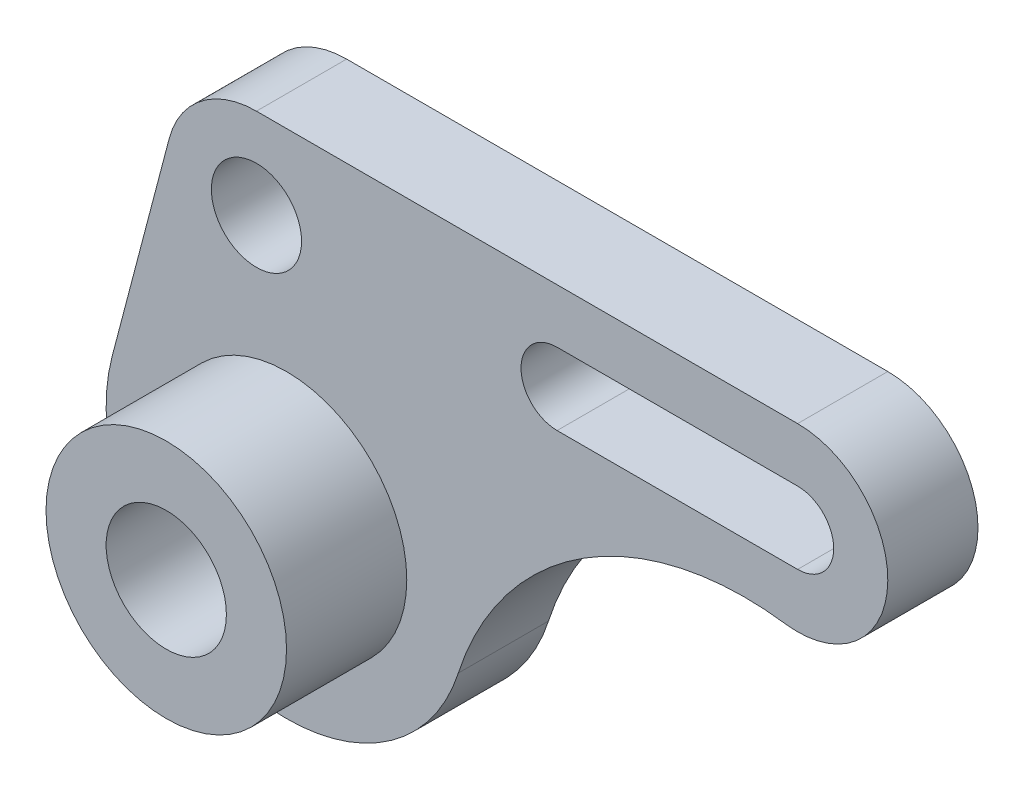
ISO-10303-21;
HEADER;
FILE_DESCRIPTION(('STEP AP214'),'2;1');
FILE_NAME('part.step','',(''),(''),'','','');
FILE_SCHEMA(('AUTOMOTIVE_DESIGN { 1 0 10303 214 1 1 1 1 }'));
ENDSEC;
DATA;
#1=APPLICATION_CONTEXT('core data for automotive mechanical design processes');
#2=APPLICATION_PROTOCOL_DEFINITION('international standard','automotive_design',2000,#1);
#3=PRODUCT_CONTEXT('',#1,'mechanical');
#4=PRODUCT('Part','Part','',(#3));
#5=PRODUCT_RELATED_PRODUCT_CATEGORY('part','',(#4));
#6=PRODUCT_DEFINITION_FORMATION('','',#4);
#7=PRODUCT_DEFINITION_CONTEXT('part definition',#1,'design');
#8=PRODUCT_DEFINITION('design','',#6,#7);
#9=PRODUCT_DEFINITION_SHAPE('','',#8);
#10=(LENGTH_UNIT() NAMED_UNIT(*) SI_UNIT(.MILLI.,.METRE.));
#11=(NAMED_UNIT(*) PLANE_ANGLE_UNIT() SI_UNIT($,.RADIAN.));
#12=(NAMED_UNIT(*) SI_UNIT($,.STERADIAN.) SOLID_ANGLE_UNIT());
#13=UNCERTAINTY_MEASURE_WITH_UNIT(LENGTH_MEASURE(1.E-05),#10,'distance_accuracy_value','');
#14=(GEOMETRIC_REPRESENTATION_CONTEXT(3) GLOBAL_UNCERTAINTY_ASSIGNED_CONTEXT((#13)) GLOBAL_UNIT_ASSIGNED_CONTEXT((#10,
#11,#12)) REPRESENTATION_CONTEXT('',''));
#15=CARTESIAN_POINT('',(0.,0.,0.));
#16=DIRECTION('',(0.,0.,1.));
#17=DIRECTION('',(1.,0.,0.));
#18=AXIS2_PLACEMENT_3D('',#15,#16,#17);
#19=CARTESIAN_POINT('',(0.,0.,7.5));
#20=DIRECTION('',(0.,0.,1.));
#21=DIRECTION('',(1.,0.,0.));
#22=AXIS2_PLACEMENT_3D('',#19,#20,#21);
#23=PLANE('',#22);
#24=DIRECTION('',(1.,0.,0.));
#25=VECTOR('',#24,1.);
#26=CARTESIAN_POINT('',(0.,55.,7.5));
#27=LINE('',#26,#25);
#28=CARTESIAN_POINT('',(-5.00000000000001,55.,7.5));
#29=VERTEX_POINT('',#28);
#30=CARTESIAN_POINT('',(85.,55.,7.5));
#31=VERTEX_POINT('',#30);
#32=EDGE_CURVE('E214',#29,#31,#27,.T.);
#33=ORIENTED_EDGE('',*,*,#32,.F.);
#34=CARTESIAN_POINT('',(-5.00000000000001,40.,7.5));
#35=DIRECTION('',(0.,0.,1.));
#36=DIRECTION('',(1.,0.,0.));
#37=AXIS2_PLACEMENT_3D('',#34,#35,#36);
#38=CIRCLE('',#37,15.);
#39=CARTESIAN_POINT('',(-19.507658043473,43.8115427445659,7.5));
#40=VERTEX_POINT('',#39);
#41=EDGE_CURVE('E223',#29,#40,#38,.T.);
#42=ORIENTED_EDGE('',*,*,#41,.T.);
#43=DIRECTION('',(0.254102849637725,0.967177202898201,0.));
#44=VECTOR('',#43,1.);
#45=CARTESIAN_POINT('',(-29.015316086946,7.62308548913174,7.5));
#46=LINE('',#45,#44);
#47=CARTESIAN_POINT('',(-29.015316086946,7.62308548913174,7.5));
#48=VERTEX_POINT('',#47);
#49=EDGE_CURVE('E132',#48,#40,#46,.T.);
#50=ORIENTED_EDGE('',*,*,#49,.F.);
#51=CARTESIAN_POINT('',(0.,0.,7.5));
#52=DIRECTION('',(0.,0.,1.));
#53=DIRECTION('',(1.,0.,0.));
#54=AXIS2_PLACEMENT_3D('',#51,#52,#53);
#55=CIRCLE('',#54,30.);
#56=CARTESIAN_POINT('',(28.570577695616,-9.14997760318401,7.5));
#57=VERTEX_POINT('',#56);
#58=EDGE_CURVE('E126',#48,#57,#55,.T.);
#59=ORIENTED_EDGE('',*,*,#58,.T.);
#60=CARTESIAN_POINT('',(76.1882071883094,-24.3999402751574,7.5));
#61=DIRECTION('',(0.,0.,1.));
#62=DIRECTION('',(1.,0.,0.));
#63=AXIS2_PLACEMENT_3D('',#60,#61,#62);
#64=CIRCLE('',#63,50.);
#65=CARTESIAN_POINT('',(82.9665093511483,25.1384753211175,7.5));
#66=VERTEX_POINT('',#65);
#67=EDGE_CURVE('E130',#66,#57,#64,.T.);
#68=ORIENTED_EDGE('',*,*,#67,.F.);
#69=CARTESIAN_POINT('',(85.,40.,7.5));
#70=DIRECTION('',(0.,0.,1.));
#71=DIRECTION('',(1.,0.,0.));
#72=AXIS2_PLACEMENT_3D('',#69,#70,#71);
#73=CIRCLE('',#72,15.);
#74=EDGE_CURVE('E58',#66,#31,#73,.T.);
#75=ORIENTED_EDGE('',*,*,#74,.T.);
#76=EDGE_LOOP('',(#33,#42,#50,#59,#68,#75));
#77=FACE_BOUND('',#76,.T.);
#78=CARTESIAN_POINT('',(45.,40.,7.5));
#79=DIRECTION('',(0.,0.,1.));
#80=DIRECTION('',(1.,0.,0.));
#81=AXIS2_PLACEMENT_3D('',#78,#79,#80);
#82=CIRCLE('',#81,5.99999999999999);
#83=CARTESIAN_POINT('',(45.,46.,7.5));
#84=VERTEX_POINT('',#83);
#85=CARTESIAN_POINT('',(45.,34.,7.5));
#86=VERTEX_POINT('',#85);
#87=EDGE_CURVE('E218',#84,#86,#82,.T.);
#88=ORIENTED_EDGE('',*,*,#87,.F.);
#89=DIRECTION('',(-1.,0.,0.));
#90=VECTOR('',#89,1.);
#91=CARTESIAN_POINT('',(0.,46.,7.5));
#92=LINE('',#91,#90);
#93=CARTESIAN_POINT('',(85.,46.,7.5));
#94=VERTEX_POINT('',#93);
#95=EDGE_CURVE('E200',#94,#84,#92,.T.);
#96=ORIENTED_EDGE('',*,*,#95,.F.);
#97=CARTESIAN_POINT('',(85.,40.,7.5));
#98=DIRECTION('',(0.,0.,1.));
#99=DIRECTION('',(1.,0.,0.));
#100=AXIS2_PLACEMENT_3D('',#97,#98,#99);
#101=CIRCLE('',#100,6.);
#102=CARTESIAN_POINT('',(85.,34.,7.5));
#103=VERTEX_POINT('',#102);
#104=EDGE_CURVE('E210',#103,#94,#101,.T.);
#105=ORIENTED_EDGE('',*,*,#104,.F.);
#106=DIRECTION('',(-1.,0.,0.));
#107=VECTOR('',#106,1.);
#108=CARTESIAN_POINT('',(0.,34.,7.5));
#109=LINE('',#108,#107);
#110=EDGE_CURVE('E212',#103,#86,#109,.T.);
#111=ORIENTED_EDGE('',*,*,#110,.T.);
#112=EDGE_LOOP('',(#88,#96,#105,#111));
#113=FACE_BOUND('',#112,.T.);
#114=CARTESIAN_POINT('',(-5.00000000000001,40.,7.5));
#115=DIRECTION('',(0.,0.,1.));
#116=DIRECTION('',(1.,0.,0.));
#117=AXIS2_PLACEMENT_3D('',#114,#115,#116);
#118=CIRCLE('',#117,7.5);
#119=CARTESIAN_POINT('',(2.49999999999999,40.,7.5));
#120=VERTEX_POINT('',#119);
#121=EDGE_CURVE('E184',#120,#120,#118,.T.);
#122=ORIENTED_EDGE('',*,*,#121,.F.);
#123=EDGE_LOOP('',(#122));
#124=FACE_BOUND('',#123,.T.);
#125=CARTESIAN_POINT('',(0.,0.,7.5));
#126=DIRECTION('',(0.,0.,1.));
#127=DIRECTION('',(1.,0.,0.));
#128=AXIS2_PLACEMENT_3D('',#125,#126,#127);
#129=CIRCLE('',#128,20.);
#130=CARTESIAN_POINT('',(20.,0.,7.5));
#131=VERTEX_POINT('',#130);
#132=EDGE_CURVE('E411',#131,#131,#129,.T.);
#133=ORIENTED_EDGE('',*,*,#132,.F.);
#134=EDGE_LOOP('',(#133));
#135=FACE_BOUND('',#134,.T.);
#136=ADVANCED_FACE('F39',(#77,#113,#124,#135),#23,.T.);
#137=CARTESIAN_POINT('',(0.,55.,7.5));
#138=DIRECTION('',(0.,1.,0.));
#139=DIRECTION('',(0.,0.,1.));
#140=AXIS2_PLACEMENT_3D('',#137,#138,#139);
#141=PLANE('',#140);
#142=DIRECTION('',(1.,0.,0.));
#143=VECTOR('',#142,1.);
#144=CARTESIAN_POINT('',(0.,55.,-7.5));
#145=LINE('',#144,#143);
#146=CARTESIAN_POINT('',(-5.00000000000001,55.,-7.5));
#147=VERTEX_POINT('',#146);
#148=CARTESIAN_POINT('',(85.,55.,-7.5));
#149=VERTEX_POINT('',#148);
#150=EDGE_CURVE('E170',#147,#149,#145,.T.);
#151=ORIENTED_EDGE('',*,*,#150,.F.);
#152=DIRECTION('',(0.,0.,-1.));
#153=VECTOR('',#152,1.);
#154=CARTESIAN_POINT('',(-5.00000000000001,55.,7.5));
#155=LINE('',#154,#153);
#156=EDGE_CURVE('E11',#29,#147,#155,.T.);
#157=ORIENTED_EDGE('',*,*,#156,.F.);
#158=ORIENTED_EDGE('',*,*,#32,.T.);
#159=DIRECTION('',(0.,0.,-1.));
#160=VECTOR('',#159,1.);
#161=CARTESIAN_POINT('',(85.,55.,7.5));
#162=LINE('',#161,#160);
#163=EDGE_CURVE('E98',#31,#149,#162,.T.);
#164=ORIENTED_EDGE('',*,*,#163,.T.);
#165=EDGE_LOOP('',(#151,#157,#158,#164));
#166=FACE_BOUND('',#165,.T.);
#167=ADVANCED_FACE('F230',(#166),#141,.T.);
#168=CARTESIAN_POINT('',(-5.00000000000001,40.,7.5));
#169=DIRECTION('',(0.,0.,-1.));
#170=DIRECTION('',(-1.,0.,0.));
#171=AXIS2_PLACEMENT_3D('',#168,#169,#170);
#172=CYLINDRICAL_SURFACE('',#171,15.);
#173=CARTESIAN_POINT('',(-5.00000000000001,40.,-7.5));
#174=DIRECTION('',(0.,0.,1.));
#175=DIRECTION('',(1.,0.,0.));
#176=AXIS2_PLACEMENT_3D('',#173,#174,#175);
#177=CIRCLE('',#176,15.);
#178=CARTESIAN_POINT('',(-19.507658043473,43.8115427445659,-7.5));
#179=VERTEX_POINT('',#178);
#180=EDGE_CURVE('E173',#147,#179,#177,.T.);
#181=ORIENTED_EDGE('',*,*,#180,.T.);
#182=DIRECTION('',(0.,0.,-1.));
#183=VECTOR('',#182,1.);
#184=CARTESIAN_POINT('',(-19.507658043473,43.8115427445659,7.5));
#185=LINE('',#184,#183);
#186=EDGE_CURVE('E49',#40,#179,#185,.T.);
#187=ORIENTED_EDGE('',*,*,#186,.F.);
#188=ORIENTED_EDGE('',*,*,#41,.F.);
#189=ORIENTED_EDGE('',*,*,#156,.T.);
#190=EDGE_LOOP('',(#181,#187,#188,#189));
#191=FACE_BOUND('',#190,.T.);
#192=ADVANCED_FACE('F233',(#191),#172,.T.);
#193=CARTESIAN_POINT('',(-29.015316086946,7.62308548913174,7.5));
#194=DIRECTION('',(-0.967177202898201,0.254102849637725,0.));
#195=DIRECTION('',(-0.254102849637725,-0.967177202898201,0.));
#196=AXIS2_PLACEMENT_3D('',#193,#194,#195);
#197=PLANE('',#196);
#198=DIRECTION('',(0.254102849637725,0.967177202898201,0.));
#199=VECTOR('',#198,1.);
#200=CARTESIAN_POINT('',(-29.015316086946,7.62308548913174,-7.5));
#201=LINE('',#200,#199);
#202=CARTESIAN_POINT('',(-29.015316086946,7.62308548913174,-7.5));
#203=VERTEX_POINT('',#202);
#204=EDGE_CURVE('E176',#203,#179,#201,.T.);
#205=ORIENTED_EDGE('',*,*,#204,.F.);
#206=DIRECTION('',(0.,0.,-1.));
#207=VECTOR('',#206,1.);
#208=CARTESIAN_POINT('',(-29.015316086946,7.62308548913174,7.5));
#209=LINE('',#208,#207);
#210=EDGE_CURVE('E143',#48,#203,#209,.T.);
#211=ORIENTED_EDGE('',*,*,#210,.F.);
#212=ORIENTED_EDGE('',*,*,#49,.T.);
#213=ORIENTED_EDGE('',*,*,#186,.T.);
#214=EDGE_LOOP('',(#205,#211,#212,#213));
#215=FACE_BOUND('',#214,.T.);
#216=ADVANCED_FACE('F226',(#215),#197,.T.);
#217=CARTESIAN_POINT('',(0.,0.,7.5));
#218=DIRECTION('',(0.,0.,-1.));
#219=DIRECTION('',(-1.,0.,0.));
#220=AXIS2_PLACEMENT_3D('',#217,#218,#219);
#221=CYLINDRICAL_SURFACE('',#220,30.);
#222=CARTESIAN_POINT('',(0.,0.,-7.5));
#223=DIRECTION('',(0.,0.,1.));
#224=DIRECTION('',(1.,0.,0.));
#225=AXIS2_PLACEMENT_3D('',#222,#223,#224);
#226=CIRCLE('',#225,30.);
#227=CARTESIAN_POINT('',(28.570577695616,-9.14997760318401,-7.5));
#228=VERTEX_POINT('',#227);
#229=EDGE_CURVE('E139',#203,#228,#226,.T.);
#230=ORIENTED_EDGE('',*,*,#229,.T.);
#231=DIRECTION('',(0.,0.,-1.));
#232=VECTOR('',#231,1.);
#233=CARTESIAN_POINT('',(28.570577695616,-9.14997760318401,7.5));
#234=LINE('',#233,#232);
#235=EDGE_CURVE('E136',#57,#228,#234,.T.);
#236=ORIENTED_EDGE('',*,*,#235,.F.);
#237=ORIENTED_EDGE('',*,*,#58,.F.);
#238=ORIENTED_EDGE('',*,*,#210,.T.);
#239=EDGE_LOOP('',(#230,#236,#237,#238));
#240=FACE_BOUND('',#239,.T.);
#241=ADVANCED_FACE('F137',(#240),#221,.T.);
#242=CARTESIAN_POINT('',(76.1882071883094,-24.3999402751574,7.5));
#243=DIRECTION('',(0.,0.,-1.));
#244=DIRECTION('',(-1.,0.,0.));
#245=AXIS2_PLACEMENT_3D('',#242,#243,#244);
#246=CYLINDRICAL_SURFACE('',#245,50.);
#247=CARTESIAN_POINT('',(76.1882071883094,-24.3999402751574,-7.5));
#248=DIRECTION('',(0.,0.,1.));
#249=DIRECTION('',(1.,0.,0.));
#250=AXIS2_PLACEMENT_3D('',#247,#248,#249);
#251=CIRCLE('',#250,50.);
#252=CARTESIAN_POINT('',(82.9665093511483,25.1384753211175,-7.5));
#253=VERTEX_POINT('',#252);
#254=EDGE_CURVE('E180',#253,#228,#251,.T.);
#255=ORIENTED_EDGE('',*,*,#254,.F.);
#256=DIRECTION('',(0.,0.,-1.));
#257=VECTOR('',#256,1.);
#258=CARTESIAN_POINT('',(82.9665093511483,25.1384753211175,7.5));
#259=LINE('',#258,#257);
#260=EDGE_CURVE('E91',#66,#253,#259,.T.);
#261=ORIENTED_EDGE('',*,*,#260,.F.);
#262=ORIENTED_EDGE('',*,*,#67,.T.);
#263=ORIENTED_EDGE('',*,*,#235,.T.);
#264=EDGE_LOOP('',(#255,#261,#262,#263));
#265=FACE_BOUND('',#264,.T.);
#266=ADVANCED_FACE('F145',(#265),#246,.F.);
#267=CARTESIAN_POINT('',(45.,40.,7.5));
#268=DIRECTION('',(0.,0.,-1.));
#269=DIRECTION('',(-1.,0.,0.));
#270=AXIS2_PLACEMENT_3D('',#267,#268,#269);
#271=CYLINDRICAL_SURFACE('',#270,5.99999999999999);
#272=CARTESIAN_POINT('',(45.,40.,-7.5));
#273=DIRECTION('',(0.,0.,1.));
#274=DIRECTION('',(1.,0.,0.));
#275=AXIS2_PLACEMENT_3D('',#272,#273,#274);
#276=CIRCLE('',#275,5.99999999999999);
#277=CARTESIAN_POINT('',(45.,46.,-7.5));
#278=VERTEX_POINT('',#277);
#279=CARTESIAN_POINT('',(45.,34.,-7.5));
#280=VERTEX_POINT('',#279);
#281=EDGE_CURVE('E158',#278,#280,#276,.T.);
#282=ORIENTED_EDGE('',*,*,#281,.F.);
#283=DIRECTION('',(0.,0.,-1.));
#284=VECTOR('',#283,1.);
#285=CARTESIAN_POINT('',(45.,46.,7.5));
#286=LINE('',#285,#284);
#287=EDGE_CURVE('E43',#84,#278,#286,.T.);
#288=ORIENTED_EDGE('',*,*,#287,.F.);
#289=ORIENTED_EDGE('',*,*,#87,.T.);
#290=DIRECTION('',(0.,0.,-1.));
#291=VECTOR('',#290,1.);
#292=CARTESIAN_POINT('',(45.,34.,7.5));
#293=LINE('',#292,#291);
#294=EDGE_CURVE('E147',#86,#280,#293,.T.);
#295=ORIENTED_EDGE('',*,*,#294,.T.);
#296=EDGE_LOOP('',(#282,#288,#289,#295));
#297=FACE_BOUND('',#296,.T.);
#298=ADVANCED_FACE('F201',(#297),#271,.F.);
#299=CARTESIAN_POINT('',(0.,46.,7.5));
#300=DIRECTION('',(0.,-1.,0.));
#301=DIRECTION('',(1.,0.,0.));
#302=AXIS2_PLACEMENT_3D('',#299,#300,#301);
#303=PLANE('',#302);
#304=DIRECTION('',(-1.,0.,0.));
#305=VECTOR('',#304,1.);
#306=CARTESIAN_POINT('',(0.,46.,-7.5));
#307=LINE('',#306,#305);
#308=CARTESIAN_POINT('',(85.,46.,-7.5));
#309=VERTEX_POINT('',#308);
#310=EDGE_CURVE('E161',#309,#278,#307,.T.);
#311=ORIENTED_EDGE('',*,*,#310,.F.);
#312=DIRECTION('',(0.,0.,-1.));
#313=VECTOR('',#312,1.);
#314=CARTESIAN_POINT('',(85.,46.,7.5));
#315=LINE('',#314,#313);
#316=EDGE_CURVE('E191',#94,#309,#315,.T.);
#317=ORIENTED_EDGE('',*,*,#316,.F.);
#318=ORIENTED_EDGE('',*,*,#95,.T.);
#319=ORIENTED_EDGE('',*,*,#287,.T.);
#320=EDGE_LOOP('',(#311,#317,#318,#319));
#321=FACE_BOUND('',#320,.T.);
#322=ADVANCED_FACE('F198',(#321),#303,.T.);
#323=CARTESIAN_POINT('',(85.,40.,7.5));
#324=DIRECTION('',(0.,0.,-1.));
#325=DIRECTION('',(-1.,0.,0.));
#326=AXIS2_PLACEMENT_3D('',#323,#324,#325);
#327=CYLINDRICAL_SURFACE('',#326,6.);
#328=CARTESIAN_POINT('',(85.,40.,-7.5));
#329=DIRECTION('',(0.,0.,1.));
#330=DIRECTION('',(1.,0.,0.));
#331=AXIS2_PLACEMENT_3D('',#328,#329,#330);
#332=CIRCLE('',#331,6.);
#333=CARTESIAN_POINT('',(85.,34.,-7.5));
#334=VERTEX_POINT('',#333);
#335=EDGE_CURVE('E164',#334,#309,#332,.T.);
#336=ORIENTED_EDGE('',*,*,#335,.F.);
#337=DIRECTION('',(0.,0.,-1.));
#338=VECTOR('',#337,1.);
#339=CARTESIAN_POINT('',(85.,34.,7.5));
#340=LINE('',#339,#338);
#341=EDGE_CURVE('E190',#103,#334,#340,.T.);
#342=ORIENTED_EDGE('',*,*,#341,.F.);
#343=ORIENTED_EDGE('',*,*,#104,.T.);
#344=ORIENTED_EDGE('',*,*,#316,.T.);
#345=EDGE_LOOP('',(#336,#342,#343,#344));
#346=FACE_BOUND('',#345,.T.);
#347=ADVANCED_FACE('F207',(#346),#327,.F.);
#348=CARTESIAN_POINT('',(0.,34.,7.5));
#349=DIRECTION('',(0.,-1.,0.));
#350=DIRECTION('',(0.,0.,-1.));
#351=AXIS2_PLACEMENT_3D('',#348,#349,#350);
#352=PLANE('',#351);
#353=DIRECTION('',(-1.,0.,0.));
#354=VECTOR('',#353,1.);
#355=CARTESIAN_POINT('',(0.,34.,-7.5));
#356=LINE('',#355,#354);
#357=EDGE_CURVE('E167',#334,#280,#356,.T.);
#358=ORIENTED_EDGE('',*,*,#357,.T.);
#359=ORIENTED_EDGE('',*,*,#294,.F.);
#360=ORIENTED_EDGE('',*,*,#110,.F.);
#361=ORIENTED_EDGE('',*,*,#341,.T.);
#362=EDGE_LOOP('',(#358,#359,#360,#361));
#363=FACE_BOUND('',#362,.T.);
#364=ADVANCED_FACE('F213',(#363),#352,.F.);
#365=CARTESIAN_POINT('',(-5.00000000000001,40.,7.5));
#366=DIRECTION('',(0.,0.,-1.));
#367=DIRECTION('',(-1.,0.,0.));
#368=AXIS2_PLACEMENT_3D('',#365,#366,#367);
#369=CYLINDRICAL_SURFACE('',#368,7.5);
#370=ORIENTED_EDGE('',*,*,#121,.T.);
#371=EDGE_LOOP('',(#370));
#372=FACE_BOUND('',#371,.T.);
#373=CARTESIAN_POINT('',(-5.00000000000001,40.,-7.5));
#374=DIRECTION('',(0.,0.,1.));
#375=DIRECTION('',(1.,0.,0.));
#376=AXIS2_PLACEMENT_3D('',#373,#374,#375);
#377=CIRCLE('',#376,7.5);
#378=CARTESIAN_POINT('',(2.49999999999999,40.,-7.5));
#379=VERTEX_POINT('',#378);
#380=EDGE_CURVE('E154',#379,#379,#377,.T.);
#381=ORIENTED_EDGE('',*,*,#380,.F.);
#382=EDGE_LOOP('',(#381));
#383=FACE_BOUND('',#382,.T.);
#384=ADVANCED_FACE('F291',(#372,#383),#369,.F.);
#385=CARTESIAN_POINT('',(0.,0.,7.5));
#386=DIRECTION('',(0.,0.,-1.));
#387=DIRECTION('',(-1.,0.,0.));
#388=AXIS2_PLACEMENT_3D('',#385,#386,#387);
#389=CYLINDRICAL_SURFACE('',#388,10.);
#390=CARTESIAN_POINT('',(0.,0.,-7.5));
#391=DIRECTION('',(0.,0.,1.));
#392=DIRECTION('',(1.,0.,0.));
#393=AXIS2_PLACEMENT_3D('',#390,#391,#392);
#394=CIRCLE('',#393,10.);
#395=CARTESIAN_POINT('',(10.,0.,-7.5));
#396=VERTEX_POINT('',#395);
#397=EDGE_CURVE('E151',#396,#396,#394,.T.);
#398=ORIENTED_EDGE('',*,*,#397,.F.);
#399=EDGE_LOOP('',(#398));
#400=FACE_BOUND('',#399,.T.);
#401=CARTESIAN_POINT('',(0.,0.,27.5));
#402=DIRECTION('',(0.,0.,1.));
#403=DIRECTION('',(1.,0.,0.));
#404=AXIS2_PLACEMENT_3D('',#401,#402,#403);
#405=CIRCLE('',#404,10.);
#406=CARTESIAN_POINT('',(10.,0.,27.5));
#407=VERTEX_POINT('',#406);
#408=EDGE_CURVE('E413',#407,#407,#405,.T.);
#409=ORIENTED_EDGE('',*,*,#408,.T.);
#410=EDGE_LOOP('',(#409));
#411=FACE_BOUND('',#410,.T.);
#412=ADVANCED_FACE('F41',(#400,#411),#389,.F.);
#413=CARTESIAN_POINT('',(85.,40.,7.5));
#414=DIRECTION('',(0.,0.,-1.));
#415=DIRECTION('',(-1.,0.,0.));
#416=AXIS2_PLACEMENT_3D('',#413,#414,#415);
#417=CYLINDRICAL_SURFACE('',#416,15.);
#418=CARTESIAN_POINT('',(85.,40.,-7.5));
#419=DIRECTION('',(0.,0.,1.));
#420=DIRECTION('',(1.,0.,0.));
#421=AXIS2_PLACEMENT_3D('',#418,#419,#420);
#422=CIRCLE('',#421,15.);
#423=EDGE_CURVE('E182',#253,#149,#422,.T.);
#424=ORIENTED_EDGE('',*,*,#423,.T.);
#425=ORIENTED_EDGE('',*,*,#163,.F.);
#426=ORIENTED_EDGE('',*,*,#74,.F.);
#427=ORIENTED_EDGE('',*,*,#260,.T.);
#428=EDGE_LOOP('',(#424,#425,#426,#427));
#429=FACE_BOUND('',#428,.T.);
#430=ADVANCED_FACE('F229',(#429),#417,.T.);
#431=CARTESIAN_POINT('',(0.,0.,-7.5));
#432=DIRECTION('',(0.,0.,1.));
#433=DIRECTION('',(1.,0.,0.));
#434=AXIS2_PLACEMENT_3D('',#431,#432,#433);
#435=PLANE('',#434);
#436=ORIENTED_EDGE('',*,*,#397,.T.);
#437=EDGE_LOOP('',(#436));
#438=FACE_BOUND('',#437,.T.);
#439=ORIENTED_EDGE('',*,*,#380,.T.);
#440=EDGE_LOOP('',(#439));
#441=FACE_BOUND('',#440,.T.);
#442=ORIENTED_EDGE('',*,*,#281,.T.);
#443=ORIENTED_EDGE('',*,*,#357,.F.);
#444=ORIENTED_EDGE('',*,*,#335,.T.);
#445=ORIENTED_EDGE('',*,*,#310,.T.);
#446=EDGE_LOOP('',(#442,#443,#444,#445));
#447=FACE_BOUND('',#446,.T.);
#448=ORIENTED_EDGE('',*,*,#150,.T.);
#449=ORIENTED_EDGE('',*,*,#423,.F.);
#450=ORIENTED_EDGE('',*,*,#254,.T.);
#451=ORIENTED_EDGE('',*,*,#229,.F.);
#452=ORIENTED_EDGE('',*,*,#204,.T.);
#453=ORIENTED_EDGE('',*,*,#180,.F.);
#454=EDGE_LOOP('',(#448,#449,#450,#451,#452,#453));
#455=FACE_BOUND('',#454,.T.);
#456=ADVANCED_FACE('F205',(#438,#441,#447,#455),#435,.F.);
#457=CARTESIAN_POINT('',(0.,0.,27.5));
#458=DIRECTION('',(0.,0.,1.));
#459=DIRECTION('',(1.,0.,0.));
#460=AXIS2_PLACEMENT_3D('',#457,#458,#459);
#461=PLANE('',#460);
#462=CARTESIAN_POINT('',(0.,0.,27.5));
#463=DIRECTION('',(0.,0.,1.));
#464=DIRECTION('',(1.,0.,0.));
#465=AXIS2_PLACEMENT_3D('',#462,#463,#464);
#466=CIRCLE('',#465,20.);
#467=CARTESIAN_POINT('',(20.,0.,27.5));
#468=VERTEX_POINT('',#467);
#469=EDGE_CURVE('E155',#468,#468,#466,.T.);
#470=ORIENTED_EDGE('',*,*,#469,.T.);
#471=EDGE_LOOP('',(#470));
#472=FACE_BOUND('',#471,.T.);
#473=ORIENTED_EDGE('',*,*,#408,.F.);
#474=EDGE_LOOP('',(#473));
#475=FACE_BOUND('',#474,.T.);
#476=ADVANCED_FACE('F252',(#472,#475),#461,.T.);
#477=CARTESIAN_POINT('',(0.,0.,27.5));
#478=DIRECTION('',(0.,0.,-1.));
#479=DIRECTION('',(-1.,0.,0.));
#480=AXIS2_PLACEMENT_3D('',#477,#478,#479);
#481=CYLINDRICAL_SURFACE('',#480,20.);
#482=ORIENTED_EDGE('',*,*,#469,.F.);
#483=EDGE_LOOP('',(#482));
#484=FACE_BOUND('',#483,.T.);
#485=ORIENTED_EDGE('',*,*,#132,.T.);
#486=EDGE_LOOP('',(#485));
#487=FACE_BOUND('',#486,.T.);
#488=ADVANCED_FACE('F248',(#484,#487),#481,.T.);
#489=CLOSED_SHELL('',(#136,#167,#192,#216,#241,#266,#298,#322,#347,#364,#384,#412,#430,#456,
#476,#488));
#490=MANIFOLD_SOLID_BREP('B2',#489);
#491=ADVANCED_BREP_SHAPE_REPRESENTATION('',(#18,#490),#14);
#492=SHAPE_DEFINITION_REPRESENTATION(#9,#491);
ENDSEC;
END-ISO-10303-21;
